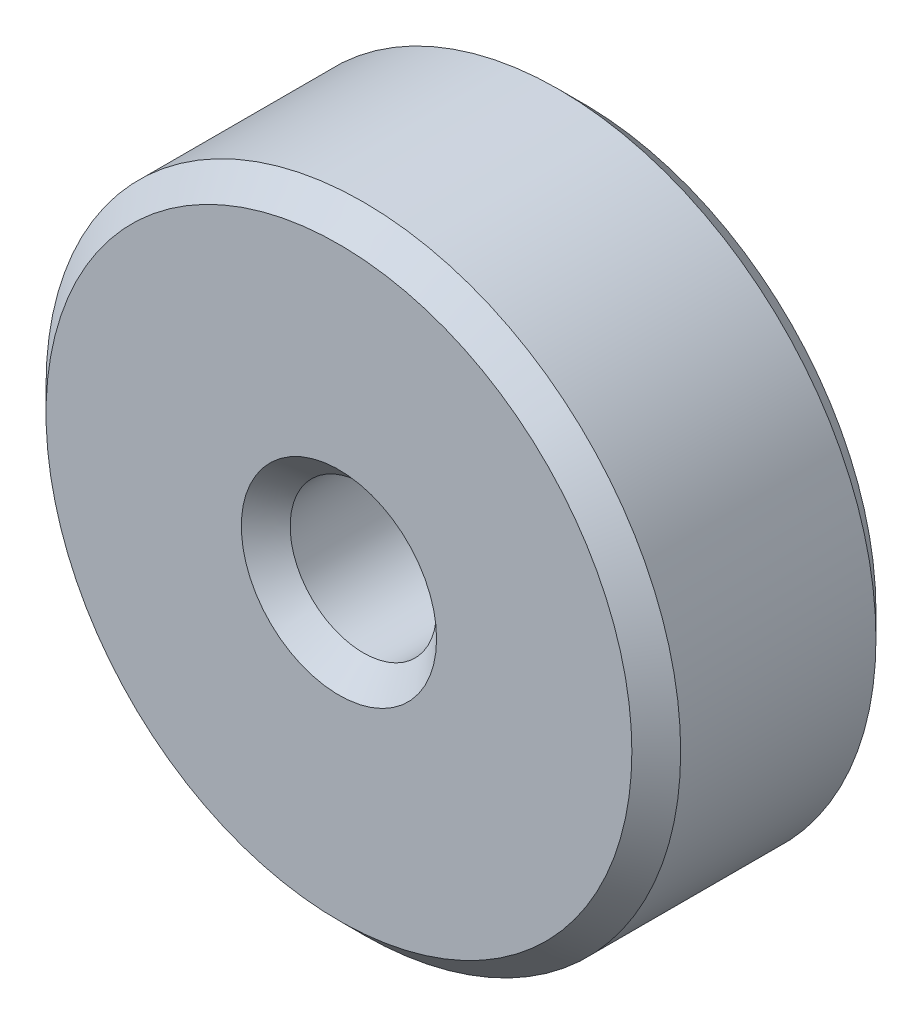
ISO-10303-21;
HEADER;
FILE_DESCRIPTION(('STEP AP214'),'2;1');
FILE_NAME('part.step','',(''),(''),'','','');
FILE_SCHEMA(('AUTOMOTIVE_DESIGN { 1 0 10303 214 1 1 1 1 }'));
ENDSEC;
DATA;
#1=APPLICATION_CONTEXT('core data for automotive mechanical design processes');
#2=APPLICATION_PROTOCOL_DEFINITION('international standard','automotive_design',2000,#1);
#3=PRODUCT_CONTEXT('',#1,'mechanical');
#4=PRODUCT('Part','Part','',(#3));
#5=PRODUCT_RELATED_PRODUCT_CATEGORY('part','',(#4));
#6=PRODUCT_DEFINITION_FORMATION('','',#4);
#7=PRODUCT_DEFINITION_CONTEXT('part definition',#1,'design');
#8=PRODUCT_DEFINITION('design','',#6,#7);
#9=PRODUCT_DEFINITION_SHAPE('','',#8);
#10=(LENGTH_UNIT() NAMED_UNIT(*) SI_UNIT(.MILLI.,.METRE.));
#11=(NAMED_UNIT(*) PLANE_ANGLE_UNIT() SI_UNIT($,.RADIAN.));
#12=(NAMED_UNIT(*) SI_UNIT($,.STERADIAN.) SOLID_ANGLE_UNIT());
#13=UNCERTAINTY_MEASURE_WITH_UNIT(LENGTH_MEASURE(1.E-05),#10,'distance_accuracy_value','');
#14=(GEOMETRIC_REPRESENTATION_CONTEXT(3) GLOBAL_UNCERTAINTY_ASSIGNED_CONTEXT((#13)) GLOBAL_UNIT_ASSIGNED_CONTEXT((#10,
#11,#12)) REPRESENTATION_CONTEXT('',''));
#15=CARTESIAN_POINT('',(0.,0.,0.));
#16=DIRECTION('',(0.,0.,1.));
#17=DIRECTION('',(1.,0.,0.));
#18=AXIS2_PLACEMENT_3D('',#15,#16,#17);
#19=CARTESIAN_POINT('',(0.,0.,5.));
#20=DIRECTION('',(0.,0.,1.));
#21=DIRECTION('',(1.,0.,0.));
#22=AXIS2_PLACEMENT_3D('',#19,#20,#21);
#23=PLANE('',#22);
#24=CARTESIAN_POINT('',(0.,0.,5.));
#25=DIRECTION('',(0.,0.,1.));
#26=DIRECTION('',(1.,0.,0.));
#27=AXIS2_PLACEMENT_3D('',#24,#25,#26);
#28=CIRCLE('',#27,2.00000000000001);
#29=CARTESIAN_POINT('',(2.00000000000001,0.,5.));
#30=VERTEX_POINT('',#29);
#31=EDGE_CURVE('E10',#30,#30,#28,.F.);
#32=ORIENTED_EDGE('',*,*,#31,.T.);
#33=EDGE_LOOP('',(#32));
#34=FACE_BOUND('',#33,.T.);
#35=CARTESIAN_POINT('',(0.,0.,5.));
#36=DIRECTION('',(0.,0.,1.));
#37=DIRECTION('',(1.,0.,0.));
#38=AXIS2_PLACEMENT_3D('',#35,#36,#37);
#39=CIRCLE('',#38,6.);
#40=CARTESIAN_POINT('',(6.,0.,5.));
#41=VERTEX_POINT('',#40);
#42=EDGE_CURVE('E38',#41,#41,#39,.T.);
#43=ORIENTED_EDGE('',*,*,#42,.T.);
#44=EDGE_LOOP('',(#43));
#45=FACE_BOUND('',#44,.T.);
#46=ADVANCED_FACE('F31',(#34,#45),#23,.T.);
#47=CARTESIAN_POINT('',(0.,0.,0.));
#48=DIRECTION('',(0.,0.,1.));
#49=DIRECTION('',(1.,0.,0.));
#50=AXIS2_PLACEMENT_3D('',#47,#48,#49);
#51=PLANE('',#50);
#52=CARTESIAN_POINT('',(0.,0.,0.));
#53=DIRECTION('',(0.,0.,1.));
#54=DIRECTION('',(1.,0.,0.));
#55=AXIS2_PLACEMENT_3D('',#52,#53,#54);
#56=CIRCLE('',#55,2.);
#57=CARTESIAN_POINT('',(2.,0.,0.));
#58=VERTEX_POINT('',#57);
#59=EDGE_CURVE('E57',#58,#58,#56,.T.);
#60=ORIENTED_EDGE('',*,*,#59,.T.);
#61=EDGE_LOOP('',(#60));
#62=FACE_BOUND('',#61,.T.);
#63=CARTESIAN_POINT('',(0.,0.,0.));
#64=DIRECTION('',(0.,0.,1.));
#65=DIRECTION('',(1.,0.,0.));
#66=AXIS2_PLACEMENT_3D('',#63,#64,#65);
#67=CIRCLE('',#66,6.);
#68=CARTESIAN_POINT('',(6.,0.,0.));
#69=VERTEX_POINT('',#68);
#70=EDGE_CURVE('E60',#69,#69,#67,.F.);
#71=ORIENTED_EDGE('',*,*,#70,.T.);
#72=EDGE_LOOP('',(#71));
#73=FACE_BOUND('',#72,.T.);
#74=ADVANCED_FACE('F64',(#62,#73),#51,.F.);
#75=CARTESIAN_POINT('',(0.,0.,5.));
#76=DIRECTION('',(0.,0.,-1.));
#77=DIRECTION('',(-1.,0.,0.));
#78=AXIS2_PLACEMENT_3D('',#75,#76,#77);
#79=CYLINDRICAL_SURFACE('',#78,6.5);
#80=CARTESIAN_POINT('',(0.,0.,0.5));
#81=DIRECTION('',(0.,0.,1.));
#82=DIRECTION('',(1.,0.,0.));
#83=AXIS2_PLACEMENT_3D('',#80,#81,#82);
#84=CIRCLE('',#83,6.5);
#85=CARTESIAN_POINT('',(6.5,0.,0.5));
#86=VERTEX_POINT('',#85);
#87=EDGE_CURVE('E42',#86,#86,#84,.T.);
#88=ORIENTED_EDGE('',*,*,#87,.T.);
#89=EDGE_LOOP('',(#88));
#90=FACE_BOUND('',#89,.T.);
#91=CARTESIAN_POINT('',(0.,0.,4.5));
#92=DIRECTION('',(0.,0.,1.));
#93=DIRECTION('',(1.,0.,0.));
#94=AXIS2_PLACEMENT_3D('',#91,#92,#93);
#95=CIRCLE('',#94,6.5);
#96=CARTESIAN_POINT('',(6.5,0.,4.5));
#97=VERTEX_POINT('',#96);
#98=EDGE_CURVE('E46',#97,#97,#95,.F.);
#99=ORIENTED_EDGE('',*,*,#98,.T.);
#100=EDGE_LOOP('',(#99));
#101=FACE_BOUND('',#100,.T.);
#102=ADVANCED_FACE('F74',(#90,#101),#79,.T.);
#103=CARTESIAN_POINT('',(0.,0.,5.));
#104=DIRECTION('',(0.,0.,-1.));
#105=DIRECTION('',(-1.,0.,0.));
#106=AXIS2_PLACEMENT_3D('',#103,#104,#105);
#107=CYLINDRICAL_SURFACE('',#106,1.5);
#108=CARTESIAN_POINT('',(0.,0.,0.500000000000001));
#109=DIRECTION('',(0.,0.,1.));
#110=DIRECTION('',(1.,0.,0.));
#111=AXIS2_PLACEMENT_3D('',#108,#109,#110);
#112=CIRCLE('',#111,1.5);
#113=CARTESIAN_POINT('',(1.5,0.,0.500000000000001));
#114=VERTEX_POINT('',#113);
#115=EDGE_CURVE('E51',#114,#114,#112,.F.);
#116=ORIENTED_EDGE('',*,*,#115,.T.);
#117=EDGE_LOOP('',(#116));
#118=FACE_BOUND('',#117,.T.);
#119=CARTESIAN_POINT('',(0.,0.,4.49999999999999));
#120=DIRECTION('',(0.,0.,1.));
#121=DIRECTION('',(1.,0.,0.));
#122=AXIS2_PLACEMENT_3D('',#119,#120,#121);
#123=CIRCLE('',#122,1.5);
#124=CARTESIAN_POINT('',(1.5,0.,4.49999999999999));
#125=VERTEX_POINT('',#124);
#126=EDGE_CURVE('E54',#125,#125,#123,.T.);
#127=ORIENTED_EDGE('',*,*,#126,.T.);
#128=EDGE_LOOP('',(#127));
#129=FACE_BOUND('',#128,.T.);
#130=ADVANCED_FACE('F77',(#118,#129),#107,.F.);
#131=CARTESIAN_POINT('',(0.,0.,0.));
#132=DIRECTION('',(0.,0.,-1.));
#133=DIRECTION('',(-1.,0.,0.));
#134=AXIS2_PLACEMENT_3D('',#131,#132,#133);
#135=CONICAL_SURFACE('',#134,2.,0.785398163397445);
#136=ORIENTED_EDGE('',*,*,#115,.F.);
#137=EDGE_LOOP('',(#136));
#138=FACE_BOUND('',#137,.T.);
#139=ORIENTED_EDGE('',*,*,#59,.F.);
#140=EDGE_LOOP('',(#139));
#141=FACE_BOUND('',#140,.T.);
#142=ADVANCED_FACE('F70',(#138,#141),#135,.F.);
#143=CARTESIAN_POINT('',(0.,0.,0.5));
#144=DIRECTION('',(0.,0.,1.));
#145=DIRECTION('',(1.,0.,0.));
#146=AXIS2_PLACEMENT_3D('',#143,#144,#145);
#147=CONICAL_SURFACE('',#146,6.5,0.785398163397451);
#148=ORIENTED_EDGE('',*,*,#70,.F.);
#149=EDGE_LOOP('',(#148));
#150=FACE_BOUND('',#149,.T.);
#151=ORIENTED_EDGE('',*,*,#87,.F.);
#152=EDGE_LOOP('',(#151));
#153=FACE_BOUND('',#152,.T.);
#154=ADVANCED_FACE('F66',(#150,#153),#147,.T.);
#155=CARTESIAN_POINT('',(0.,0.,4.49999999999999));
#156=DIRECTION('',(0.,0.,1.));
#157=DIRECTION('',(1.,0.,0.));
#158=AXIS2_PLACEMENT_3D('',#155,#156,#157);
#159=CONICAL_SURFACE('',#158,1.5,0.785398163397448);
#160=ORIENTED_EDGE('',*,*,#31,.F.);
#161=EDGE_LOOP('',(#160));
#162=FACE_BOUND('',#161,.T.);
#163=ORIENTED_EDGE('',*,*,#126,.F.);
#164=EDGE_LOOP('',(#163));
#165=FACE_BOUND('',#164,.T.);
#166=ADVANCED_FACE('F69',(#162,#165),#159,.F.);
#167=CARTESIAN_POINT('',(0.,0.,5.));
#168=DIRECTION('',(0.,0.,-1.));
#169=DIRECTION('',(-1.,0.,0.));
#170=AXIS2_PLACEMENT_3D('',#167,#168,#169);
#171=CONICAL_SURFACE('',#170,6.,0.785398163397447);
#172=ORIENTED_EDGE('',*,*,#98,.F.);
#173=EDGE_LOOP('',(#172));
#174=FACE_BOUND('',#173,.T.);
#175=ORIENTED_EDGE('',*,*,#42,.F.);
#176=EDGE_LOOP('',(#175));
#177=FACE_BOUND('',#176,.T.);
#178=ADVANCED_FACE('F33',(#174,#177),#171,.T.);
#179=CLOSED_SHELL('',(#46,#74,#102,#130,#142,#154,#166,#178));
#180=MANIFOLD_SOLID_BREP('B2',#179);
#181=ADVANCED_BREP_SHAPE_REPRESENTATION('',(#18,#180),#14);
#182=SHAPE_DEFINITION_REPRESENTATION(#9,#181);
ENDSEC;
END-ISO-10303-21;
